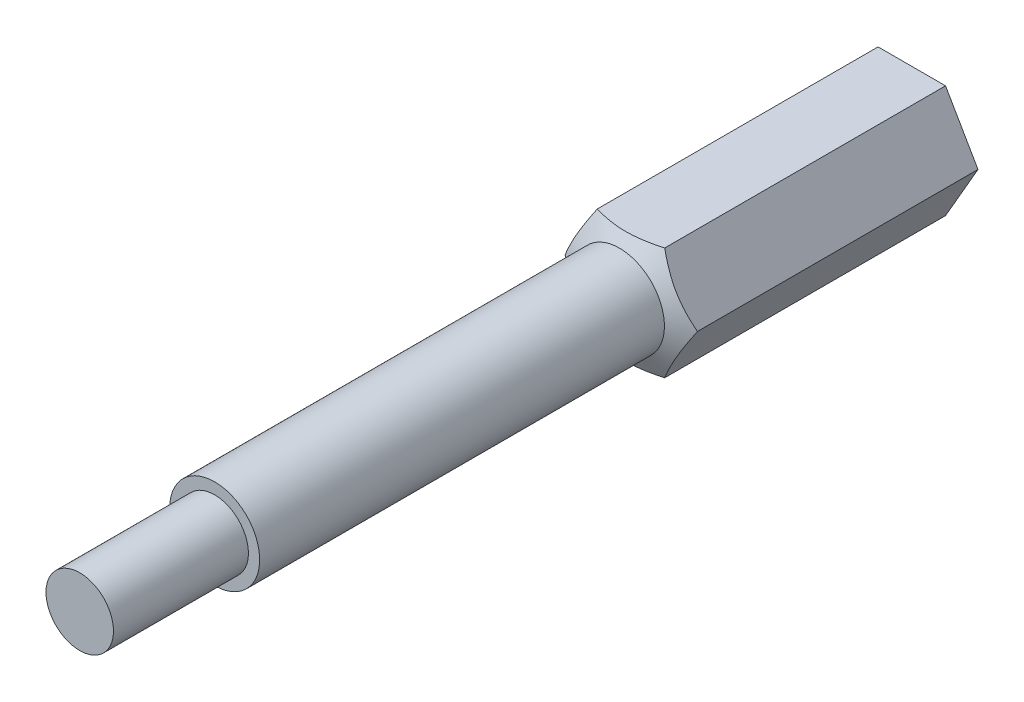
ISO-10303-21;
HEADER;
FILE_DESCRIPTION(('STEP AP214'),'2;1');
FILE_NAME('part.step','',(''),(''),'','','');
FILE_SCHEMA(('AUTOMOTIVE_DESIGN { 1 0 10303 214 1 1 1 1 }'));
ENDSEC;
DATA;
#1=APPLICATION_CONTEXT('core data for automotive mechanical design processes');
#2=APPLICATION_PROTOCOL_DEFINITION('international standard','automotive_design',2000,#1);
#3=PRODUCT_CONTEXT('',#1,'mechanical');
#4=PRODUCT('Part','Part','',(#3));
#5=PRODUCT_RELATED_PRODUCT_CATEGORY('part','',(#4));
#6=PRODUCT_DEFINITION_FORMATION('','',#4);
#7=PRODUCT_DEFINITION_CONTEXT('part definition',#1,'design');
#8=PRODUCT_DEFINITION('design','',#6,#7);
#9=PRODUCT_DEFINITION_SHAPE('','',#8);
#10=(LENGTH_UNIT() NAMED_UNIT(*) SI_UNIT(.MILLI.,.METRE.));
#11=(NAMED_UNIT(*) PLANE_ANGLE_UNIT() SI_UNIT($,.RADIAN.));
#12=(NAMED_UNIT(*) SI_UNIT($,.STERADIAN.) SOLID_ANGLE_UNIT());
#13=UNCERTAINTY_MEASURE_WITH_UNIT(LENGTH_MEASURE(1.E-05),#10,'distance_accuracy_value','');
#14=(GEOMETRIC_REPRESENTATION_CONTEXT(3) GLOBAL_UNCERTAINTY_ASSIGNED_CONTEXT((#13)) GLOBAL_UNIT_ASSIGNED_CONTEXT((#10,
#11,#12)) REPRESENTATION_CONTEXT('',''));
#15=CARTESIAN_POINT('',(0.,0.,0.));
#16=DIRECTION('',(0.,0.,1.));
#17=DIRECTION('',(1.,0.,0.));
#18=AXIS2_PLACEMENT_3D('',#15,#16,#17);
#19=CARTESIAN_POINT('',(0.,0.,7.112742413329));
#20=DIRECTION('',(0.,0.,-1.));
#21=DIRECTION('',(1.,0.,0.));
#22=AXIS2_PLACEMENT_3D('',#19,#20,#21);
#23=CONICAL_SURFACE('',#22,0.6445048558805,1.02974425867665);
#24=DIRECTION('',(-0.857167300702112,0.,-0.515038074910054));
#25=VECTOR('',#24,1.);
#26=CARTESIAN_POINT('',(-0.6445048558805,0.,7.112742413329));
#27=LINE('',#26,#25);
#28=CARTESIAN_POINT('',(0.,0.,7.5));
#29=VERTEX_POINT('',#28);
#30=CARTESIAN_POINT('',(-1.25,0.,6.748924226216));
#31=VERTEX_POINT('',#30);
#32=EDGE_CURVE('E11',#29,#31,#27,.T.);
#33=ORIENTED_EDGE('',*,*,#32,.T.);
#34=CARTESIAN_POINT('',(0.,0.,6.748924226216));
#35=DIRECTION('',(0.,0.,-1.));
#36=DIRECTION('',(1.,0.,0.));
#37=AXIS2_PLACEMENT_3D('',#34,#35,#36);
#38=CIRCLE('',#37,1.25);
#39=EDGE_CURVE('E113',#31,#31,#38,.T.);
#40=ORIENTED_EDGE('',*,*,#39,.T.);
#41=ORIENTED_EDGE('',*,*,#32,.F.);
#42=EDGE_LOOP('',(#33,#40,#41));
#43=FACE_BOUND('',#42,.T.);
#44=ADVANCED_FACE('F17',(#43),#23,.F.);
#45=CARTESIAN_POINT('',(0.,0.,7.875));
#46=DIRECTION('',(0.,0.,-1.));
#47=DIRECTION('',(1.,0.,0.));
#48=AXIS2_PLACEMENT_3D('',#45,#46,#47);
#49=CYLINDRICAL_SURFACE('',#48,1.25);
#50=ORIENTED_EDGE('',*,*,#39,.F.);
#51=DIRECTION('',(0.,0.,-1.));
#52=VECTOR('',#51,1.);
#53=CARTESIAN_POINT('',(-1.25,0.,7.875));
#54=LINE('',#53,#52);
#55=CARTESIAN_POINT('',(-1.25,0.,0.));
#56=VERTEX_POINT('',#55);
#57=EDGE_CURVE('E28',#31,#56,#54,.T.);
#58=ORIENTED_EDGE('',*,*,#57,.T.);
#59=CARTESIAN_POINT('',(0.,0.,0.));
#60=DIRECTION('',(0.,0.,-1.));
#61=DIRECTION('',(1.,0.,0.));
#62=AXIS2_PLACEMENT_3D('',#59,#60,#61);
#63=CIRCLE('',#62,1.25);
#64=EDGE_CURVE('E171',#56,#56,#63,.T.);
#65=ORIENTED_EDGE('',*,*,#64,.T.);
#66=ORIENTED_EDGE('',*,*,#57,.F.);
#67=EDGE_LOOP('',(#50,#58,#65,#66));
#68=FACE_BOUND('',#67,.T.);
#69=ADVANCED_FACE('F376',(#68),#49,.F.);
#70=CARTESIAN_POINT('',(0.,0.,37.));
#71=DIRECTION('',(0.,0.,1.));
#72=DIRECTION('',(1.,0.,0.));
#73=AXIS2_PLACEMENT_3D('',#70,#71,#72);
#74=PLANE('',#73);
#75=CARTESIAN_POINT('',(0.,0.,37.));
#76=DIRECTION('',(0.,0.,-1.));
#77=DIRECTION('',(-1.,0.,0.));
#78=AXIS2_PLACEMENT_3D('',#75,#76,#77);
#79=CIRCLE('',#78,1.5);
#80=CARTESIAN_POINT('',(-1.5,0.,37.));
#81=VERTEX_POINT('',#80);
#82=EDGE_CURVE('E107',#81,#81,#79,.T.);
#83=ORIENTED_EDGE('',*,*,#82,.F.);
#84=EDGE_LOOP('',(#83));
#85=FACE_BOUND('',#84,.T.);
#86=ADVANCED_FACE('F373',(#85),#74,.T.);
#87=CARTESIAN_POINT('',(0.,0.,38.2263871091));
#88=DIRECTION('',(0.,0.,-1.));
#89=DIRECTION('',(1.,0.,0.));
#90=AXIS2_PLACEMENT_3D('',#87,#88,#89);
#91=CYLINDRICAL_SURFACE('',#90,1.5);
#92=CARTESIAN_POINT('',(0.,0.,31.));
#93=DIRECTION('',(0.,0.,1.));
#94=DIRECTION('',(1.,0.,0.));
#95=AXIS2_PLACEMENT_3D('',#92,#93,#94);
#96=CIRCLE('',#95,1.5);
#97=CARTESIAN_POINT('',(-1.5,0.,31.));
#98=VERTEX_POINT('',#97);
#99=EDGE_CURVE('E120',#98,#98,#96,.T.);
#100=ORIENTED_EDGE('',*,*,#99,.T.);
#101=DIRECTION('',(0.,0.,1.));
#102=VECTOR('',#101,1.);
#103=CARTESIAN_POINT('',(-1.5,0.,38.2263871091));
#104=LINE('',#103,#102);
#105=EDGE_CURVE('E110',#98,#81,#104,.T.);
#106=ORIENTED_EDGE('',*,*,#105,.T.);
#107=ORIENTED_EDGE('',*,*,#82,.T.);
#108=ORIENTED_EDGE('',*,*,#105,.F.);
#109=EDGE_LOOP('',(#100,#106,#107,#108));
#110=FACE_BOUND('',#109,.T.);
#111=ADVANCED_FACE('F109',(#110),#91,.T.);
#112=CARTESIAN_POINT('',(0.,0.,31.));
#113=DIRECTION('',(0.,0.,-1.));
#114=DIRECTION('',(0.,-1.,0.));
#115=AXIS2_PLACEMENT_3D('',#112,#113,#114);
#116=PLANE('',#115);
#117=ORIENTED_EDGE('',*,*,#99,.F.);
#118=EDGE_LOOP('',(#117));
#119=FACE_BOUND('',#118,.T.);
#120=CARTESIAN_POINT('',(0.,0.,31.));
#121=DIRECTION('',(0.,0.,-1.));
#122=DIRECTION('',(1.,0.,0.));
#123=AXIS2_PLACEMENT_3D('',#120,#121,#122);
#124=CIRCLE('',#123,2.);
#125=CARTESIAN_POINT('',(-2.,0.,31.));
#126=VERTEX_POINT('',#125);
#127=EDGE_CURVE('E124',#126,#126,#124,.T.);
#128=ORIENTED_EDGE('',*,*,#127,.F.);
#129=EDGE_LOOP('',(#128));
#130=FACE_BOUND('',#129,.T.);
#131=ADVANCED_FACE('F19',(#119,#130),#116,.F.);
#132=CARTESIAN_POINT('',(0.,0.,38.2263871091));
#133=DIRECTION('',(0.,0.,-1.));
#134=DIRECTION('',(1.,0.,0.));
#135=AXIS2_PLACEMENT_3D('',#132,#133,#134);
#136=CYLINDRICAL_SURFACE('',#135,2.);
#137=CARTESIAN_POINT('',(0.,0.,13.));
#138=DIRECTION('',(0.,0.,1.));
#139=DIRECTION('',(1.,0.,0.));
#140=AXIS2_PLACEMENT_3D('',#137,#138,#139);
#141=CIRCLE('',#140,2.);
#142=CARTESIAN_POINT('',(-2.00000000000193,0.,13.0000000000034));
#143=VERTEX_POINT('',#142);
#144=EDGE_CURVE('E143',#143,#143,#141,.T.);
#145=ORIENTED_EDGE('',*,*,#144,.T.);
#146=DIRECTION('',(0.,0.,1.));
#147=VECTOR('',#146,1.);
#148=CARTESIAN_POINT('',(-2.,0.,38.2263871091));
#149=LINE('',#148,#147);
#150=EDGE_CURVE('E199',#143,#126,#149,.T.);
#151=ORIENTED_EDGE('',*,*,#150,.T.);
#152=ORIENTED_EDGE('',*,*,#127,.T.);
#153=ORIENTED_EDGE('',*,*,#150,.F.);
#154=EDGE_LOOP('',(#145,#151,#152,#153));
#155=FACE_BOUND('',#154,.T.);
#156=ADVANCED_FACE('F363',(#155),#136,.T.);
#157=CARTESIAN_POINT('',(-1.5,-2.5,0.));
#158=DIRECTION('',(0.,-1.,0.));
#159=DIRECTION('',(0.,0.,-1.));
#160=AXIS2_PLACEMENT_3D('',#157,#158,#159);
#161=PLANE('',#160);
#162=CARTESIAN_POINT('',(1.50000000000572,-2.5,12.4878654518136));
#163=CARTESIAN_POINT('',(1.71018754713259E-12,-2.5,12.9195934267447));
#164=CARTESIAN_POINT('',(-1.50000000000107,-2.5,12.4878654518149));
#165=(BOUNDED_CURVE() B_SPLINE_CURVE(2,(#162,#163,#164),.UNSPECIFIED.,.F.,
.F.) B_SPLINE_CURVE_WITH_KNOTS((3,3),(-3.93858102434804,-2.10260881381389),
.UNSPECIFIED.) CURVE() GEOMETRIC_REPRESENTATION_ITEM() RATIONAL_B_SPLINE_CURVE((5.45214661902991,
6.35824093184659,5.45214661903232)) REPRESENTATION_ITEM(''));
#166=CARTESIAN_POINT('',(1.5,-2.5,12.48786545181));
#167=VERTEX_POINT('',#166);
#168=CARTESIAN_POINT('',(-1.5,-2.5,12.48786545181));
#169=VERTEX_POINT('',#168);
#170=EDGE_CURVE('E142',#167,#169,#165,.T.);
#171=ORIENTED_EDGE('',*,*,#170,.T.);
#172=DIRECTION('',(0.,0.,1.));
#173=VECTOR('',#172,1.);
#174=CARTESIAN_POINT('',(-1.5,-2.5,0.));
#175=LINE('',#174,#173);
#176=CARTESIAN_POINT('',(-1.5,-2.5,0.));
#177=VERTEX_POINT('',#176);
#178=EDGE_CURVE('E188',#177,#169,#175,.T.);
#179=ORIENTED_EDGE('',*,*,#178,.F.);
#180=DIRECTION('',(1.,0.,0.));
#181=VECTOR('',#180,1.);
#182=CARTESIAN_POINT('',(-1.5,-2.5,0.));
#183=LINE('',#182,#181);
#184=CARTESIAN_POINT('',(1.5,-2.5,0.));
#185=VERTEX_POINT('',#184);
#186=EDGE_CURVE('E131',#177,#185,#183,.T.);
#187=ORIENTED_EDGE('',*,*,#186,.T.);
#188=DIRECTION('',(0.,0.,1.));
#189=VECTOR('',#188,1.);
#190=CARTESIAN_POINT('',(1.5,-2.5,0.));
#191=LINE('',#190,#189);
#192=EDGE_CURVE('E182',#185,#167,#191,.T.);
#193=ORIENTED_EDGE('',*,*,#192,.T.);
#194=EDGE_LOOP('',(#171,#179,#187,#193));
#195=FACE_BOUND('',#194,.T.);
#196=ADVANCED_FACE('F268',(#195),#161,.T.);
#197=CARTESIAN_POINT('',(-2.943375672974,0.,0.));
#198=DIRECTION('',(-0.866025403784429,-0.500000000000017,0.));
#199=DIRECTION('',(-0.500000000000017,0.866025403784429,0.));
#200=AXIS2_PLACEMENT_3D('',#197,#198,#199);
#201=PLANE('',#200);
#202=CARTESIAN_POINT('',(-1.49999999999892,-2.50000000000166,12.4878654518147));
#203=CARTESIAN_POINT('',(-2.21825117451339,-1.25595247314663,12.8779061678666));
#204=CARTESIAN_POINT('',(-2.94337567297466,1.13927368186429E-12,12.4722578180151));
#205=(BOUNDED_CURVE() B_SPLINE_CURVE(2,(#202,#203,#204),.UNSPECIFIED.,.F.,
.F.) B_SPLINE_CURVE_WITH_KNOTS((3,3),(-3.87827536227596,-2.12975740781355),
.UNSPECIFIED.) CURVE() GEOMETRIC_REPRESENTATION_ITEM() RATIONAL_B_SPLINE_CURVE((5.41219341655687,
6.20373659844182,5.38470118508324)) REPRESENTATION_ITEM(''));
#206=CARTESIAN_POINT('',(-2.943375672974,0.,12.47225781801));
#207=VERTEX_POINT('',#206);
#208=EDGE_CURVE('E137',#169,#207,#205,.T.);
#209=ORIENTED_EDGE('',*,*,#208,.T.);
#210=DIRECTION('',(0.,0.,1.));
#211=VECTOR('',#210,1.);
#212=CARTESIAN_POINT('',(-2.943375672974,0.,0.));
#213=LINE('',#212,#211);
#214=CARTESIAN_POINT('',(-2.943375672974,0.,0.));
#215=VERTEX_POINT('',#214);
#216=EDGE_CURVE('E181',#215,#207,#213,.T.);
#217=ORIENTED_EDGE('',*,*,#216,.F.);
#218=DIRECTION('',(0.500000000000017,-0.866025403784429,0.));
#219=VECTOR('',#218,1.);
#220=CARTESIAN_POINT('',(-2.943375672974,0.,0.));
#221=LINE('',#220,#219);
#222=EDGE_CURVE('E134',#215,#177,#221,.T.);
#223=ORIENTED_EDGE('',*,*,#222,.T.);
#224=ORIENTED_EDGE('',*,*,#178,.T.);
#225=EDGE_LOOP('',(#209,#217,#223,#224));
#226=FACE_BOUND('',#225,.T.);
#227=ADVANCED_FACE('F265',(#226),#201,.T.);
#228=CARTESIAN_POINT('',(1.5,-2.5,0.));
#229=DIRECTION('',(0.866025403784429,-0.500000000000017,0.));
#230=DIRECTION('',(0.,0.,-1.));
#231=AXIS2_PLACEMENT_3D('',#228,#229,#230);
#232=PLANE('',#231);
#233=CARTESIAN_POINT('',(2.94337567297475,1.07659466071065E-12,12.4722578180151));
#234=CARTESIAN_POINT('',(2.21825117451349,-1.25595247314667,12.8779061678665));
#235=CARTESIAN_POINT('',(1.49999999999903,-2.50000000000169,12.4878654518147));
#236=(BOUNDED_CURVE() B_SPLINE_CURVE(2,(#233,#234,#235),.UNSPECIFIED.,.F.,
.F.) B_SPLINE_CURVE_WITH_KNOTS((3,3),(2.12975740781358,3.87827536227591),
.UNSPECIFIED.) CURVE() GEOMETRIC_REPRESENTATION_ITEM() RATIONAL_B_SPLINE_CURVE((5.38470118508306,
6.20373659844153,5.4121934165567)) REPRESENTATION_ITEM(''));
#237=CARTESIAN_POINT('',(2.943375672974,0.,12.47225781801));
#238=VERTEX_POINT('',#237);
#239=EDGE_CURVE('E130',#238,#167,#236,.T.);
#240=ORIENTED_EDGE('',*,*,#239,.T.);
#241=ORIENTED_EDGE('',*,*,#192,.F.);
#242=DIRECTION('',(0.500000000000017,0.866025403784429,0.));
#243=VECTOR('',#242,1.);
#244=CARTESIAN_POINT('',(1.5,-2.5,0.));
#245=LINE('',#244,#243);
#246=CARTESIAN_POINT('',(2.943375672974,0.,0.));
#247=VERTEX_POINT('',#246);
#248=EDGE_CURVE('E135',#185,#247,#245,.T.);
#249=ORIENTED_EDGE('',*,*,#248,.T.);
#250=DIRECTION('',(0.,0.,1.));
#251=VECTOR('',#250,1.);
#252=CARTESIAN_POINT('',(2.943375672974,0.,0.));
#253=LINE('',#252,#251);
#254=EDGE_CURVE('E129',#247,#238,#253,.T.);
#255=ORIENTED_EDGE('',*,*,#254,.T.);
#256=EDGE_LOOP('',(#240,#241,#249,#255));
#257=FACE_BOUND('',#256,.T.);
#258=ADVANCED_FACE('F270',(#257),#232,.T.);
#259=CARTESIAN_POINT('',(2.943375672974,0.,0.));
#260=DIRECTION('',(0.866025403784429,0.500000000000017,0.));
#261=DIRECTION('',(0.,0.,-1.));
#262=AXIS2_PLACEMENT_3D('',#259,#260,#261);
#263=PLANE('',#262);
#264=CARTESIAN_POINT('',(1.49999999999892,2.50000000000166,12.4878654518147));
#265=CARTESIAN_POINT('',(2.21825117451339,1.25595247314663,12.8779061678666));
#266=CARTESIAN_POINT('',(2.94337567297466,-1.13927368186429E-12,12.4722578180151));
#267=(BOUNDED_CURVE() B_SPLINE_CURVE(2,(#264,#265,#266),.UNSPECIFIED.,.F.,
.F.) B_SPLINE_CURVE_WITH_KNOTS((3,3),(-3.87827536227596,-2.12975740781355),
.UNSPECIFIED.) CURVE() GEOMETRIC_REPRESENTATION_ITEM() RATIONAL_B_SPLINE_CURVE((5.41219341655687,
6.20373659844182,5.38470118508324)) REPRESENTATION_ITEM(''));
#268=CARTESIAN_POINT('',(1.5,2.5,12.48786545181));
#269=VERTEX_POINT('',#268);
#270=EDGE_CURVE('E162',#269,#238,#267,.T.);
#271=ORIENTED_EDGE('',*,*,#270,.T.);
#272=ORIENTED_EDGE('',*,*,#254,.F.);
#273=DIRECTION('',(-0.500000000000017,0.866025403784429,0.));
#274=VECTOR('',#273,1.);
#275=CARTESIAN_POINT('',(2.943375672974,0.,0.));
#276=LINE('',#275,#274);
#277=CARTESIAN_POINT('',(1.5,2.5,0.));
#278=VERTEX_POINT('',#277);
#279=EDGE_CURVE('E200',#247,#278,#276,.T.);
#280=ORIENTED_EDGE('',*,*,#279,.T.);
#281=DIRECTION('',(0.,0.,1.));
#282=VECTOR('',#281,1.);
#283=CARTESIAN_POINT('',(1.5,2.5,0.));
#284=LINE('',#283,#282);
#285=EDGE_CURVE('E126',#278,#269,#284,.T.);
#286=ORIENTED_EDGE('',*,*,#285,.T.);
#287=EDGE_LOOP('',(#271,#272,#280,#286));
#288=FACE_BOUND('',#287,.T.);
#289=ADVANCED_FACE('F272',(#288),#263,.T.);
#290=CARTESIAN_POINT('',(1.5,2.5,0.));
#291=DIRECTION('',(0.,1.,0.));
#292=DIRECTION('',(1.,0.,0.));
#293=AXIS2_PLACEMENT_3D('',#290,#291,#292);
#294=PLANE('',#293);
#295=CARTESIAN_POINT('',(-1.50000000000572,2.5,12.4878654518136));
#296=CARTESIAN_POINT('',(-1.71018754713259E-12,2.5,12.9195934267447));
#297=CARTESIAN_POINT('',(1.50000000000107,2.5,12.4878654518149));
#298=(BOUNDED_CURVE() B_SPLINE_CURVE(2,(#295,#296,#297),.UNSPECIFIED.,.F.,
.F.) B_SPLINE_CURVE_WITH_KNOTS((3,3),(-3.93858102434804,-2.10260881381389),
.UNSPECIFIED.) CURVE() GEOMETRIC_REPRESENTATION_ITEM() RATIONAL_B_SPLINE_CURVE((5.45214661902991,
6.35824093184659,5.45214661903232)) REPRESENTATION_ITEM(''));
#299=CARTESIAN_POINT('',(-1.5,2.5,12.48786545181));
#300=VERTEX_POINT('',#299);
#301=EDGE_CURVE('E155',#300,#269,#298,.T.);
#302=ORIENTED_EDGE('',*,*,#301,.T.);
#303=ORIENTED_EDGE('',*,*,#285,.F.);
#304=DIRECTION('',(-1.,0.,0.));
#305=VECTOR('',#304,1.);
#306=CARTESIAN_POINT('',(1.5,2.5,0.));
#307=LINE('',#306,#305);
#308=CARTESIAN_POINT('',(-1.5,2.5,0.));
#309=VERTEX_POINT('',#308);
#310=EDGE_CURVE('E204',#278,#309,#307,.T.);
#311=ORIENTED_EDGE('',*,*,#310,.T.);
#312=DIRECTION('',(0.,0.,1.));
#313=VECTOR('',#312,1.);
#314=CARTESIAN_POINT('',(-1.5,2.5,0.));
#315=LINE('',#314,#313);
#316=EDGE_CURVE('E21',#309,#300,#315,.T.);
#317=ORIENTED_EDGE('',*,*,#316,.T.);
#318=EDGE_LOOP('',(#302,#303,#311,#317));
#319=FACE_BOUND('',#318,.T.);
#320=ADVANCED_FACE('F274',(#319),#294,.T.);
#321=CARTESIAN_POINT('',(0.,0.,12.73612890901));
#322=DIRECTION('',(0.,0.,-1.));
#323=DIRECTION('',(1.,0.,0.));
#324=AXIS2_PLACEMENT_3D('',#321,#322,#323);
#325=CONICAL_SURFACE('',#324,2.471687836487,1.06075048598463);
#326=ORIENTED_EDGE('',*,*,#270,.F.);
#327=ORIENTED_EDGE('',*,*,#301,.F.);
#328=CARTESIAN_POINT('',(-2.94337567297475,-1.07659466071065E-12,12.4722578180151));
#329=CARTESIAN_POINT('',(-2.21825117451349,1.25595247314667,12.8779061678665));
#330=CARTESIAN_POINT('',(-1.49999999999903,2.50000000000169,12.4878654518147));
#331=(BOUNDED_CURVE() B_SPLINE_CURVE(2,(#328,#329,#330),.UNSPECIFIED.,.F.,
.F.) B_SPLINE_CURVE_WITH_KNOTS((3,3),(2.12975740781358,3.87827536227591),
.UNSPECIFIED.) CURVE() GEOMETRIC_REPRESENTATION_ITEM() RATIONAL_B_SPLINE_CURVE((5.38470118508306,
6.20373659844153,5.4121934165567)) REPRESENTATION_ITEM(''));
#332=EDGE_CURVE('E175',#207,#300,#331,.T.);
#333=ORIENTED_EDGE('',*,*,#332,.F.);
#334=DIRECTION('',(0.872722128288222,0.,0.488217253685361));
#335=VECTOR('',#334,1.);
#336=CARTESIAN_POINT('',(-2.471687836487,0.,12.73612890901));
#337=LINE('',#336,#335);
#338=EDGE_CURVE('E161',#207,#143,#337,.T.);
#339=ORIENTED_EDGE('',*,*,#338,.T.);
#340=ORIENTED_EDGE('',*,*,#144,.F.);
#341=ORIENTED_EDGE('',*,*,#338,.F.);
#342=ORIENTED_EDGE('',*,*,#208,.F.);
#343=ORIENTED_EDGE('',*,*,#170,.F.);
#344=ORIENTED_EDGE('',*,*,#239,.F.);
#345=EDGE_LOOP('',(#326,#327,#333,#339,#340,#341,#342,#343,#344));
#346=FACE_BOUND('',#345,.T.);
#347=ADVANCED_FACE('F261',(#346),#325,.T.);
#348=CARTESIAN_POINT('',(-1.5,2.5,0.));
#349=DIRECTION('',(-0.866025403784429,0.500000000000017,0.));
#350=DIRECTION('',(0.,0.,1.));
#351=AXIS2_PLACEMENT_3D('',#348,#349,#350);
#352=PLANE('',#351);
#353=ORIENTED_EDGE('',*,*,#332,.T.);
#354=ORIENTED_EDGE('',*,*,#316,.F.);
#355=DIRECTION('',(-0.500000000000017,-0.866025403784429,0.));
#356=VECTOR('',#355,1.);
#357=CARTESIAN_POINT('',(-1.5,2.5,0.));
#358=LINE('',#357,#356);
#359=EDGE_CURVE('E208',#309,#215,#358,.T.);
#360=ORIENTED_EDGE('',*,*,#359,.T.);
#361=ORIENTED_EDGE('',*,*,#216,.T.);
#362=EDGE_LOOP('',(#353,#354,#360,#361));
#363=FACE_BOUND('',#362,.T.);
#364=ADVANCED_FACE('F224',(#363),#352,.T.);
#365=CARTESIAN_POINT('',(0.,0.,0.));
#366=DIRECTION('',(0.,0.,1.));
#367=DIRECTION('',(1.,0.,0.));
#368=AXIS2_PLACEMENT_3D('',#365,#366,#367);
#369=PLANE('',#368);
#370=ORIENTED_EDGE('',*,*,#64,.F.);
#371=EDGE_LOOP('',(#370));
#372=FACE_BOUND('',#371,.T.);
#373=ORIENTED_EDGE('',*,*,#359,.F.);
#374=ORIENTED_EDGE('',*,*,#310,.F.);
#375=ORIENTED_EDGE('',*,*,#279,.F.);
#376=ORIENTED_EDGE('',*,*,#248,.F.);
#377=ORIENTED_EDGE('',*,*,#186,.F.);
#378=ORIENTED_EDGE('',*,*,#222,.F.);
#379=EDGE_LOOP('',(#373,#374,#375,#376,#377,#378));
#380=FACE_BOUND('',#379,.T.);
#381=ADVANCED_FACE('F230',(#372,#380),#369,.F.);
#382=CLOSED_SHELL('',(#44,#69,#86,#111,#131,#156,#196,#227,#258,#289,#320,#347,#364,#381));
#383=MANIFOLD_SOLID_BREP('B1',#382);
#384=ADVANCED_BREP_SHAPE_REPRESENTATION('',(#18,#383),#14);
#385=SHAPE_DEFINITION_REPRESENTATION(#9,#384);
ENDSEC;
END-ISO-10303-21;
